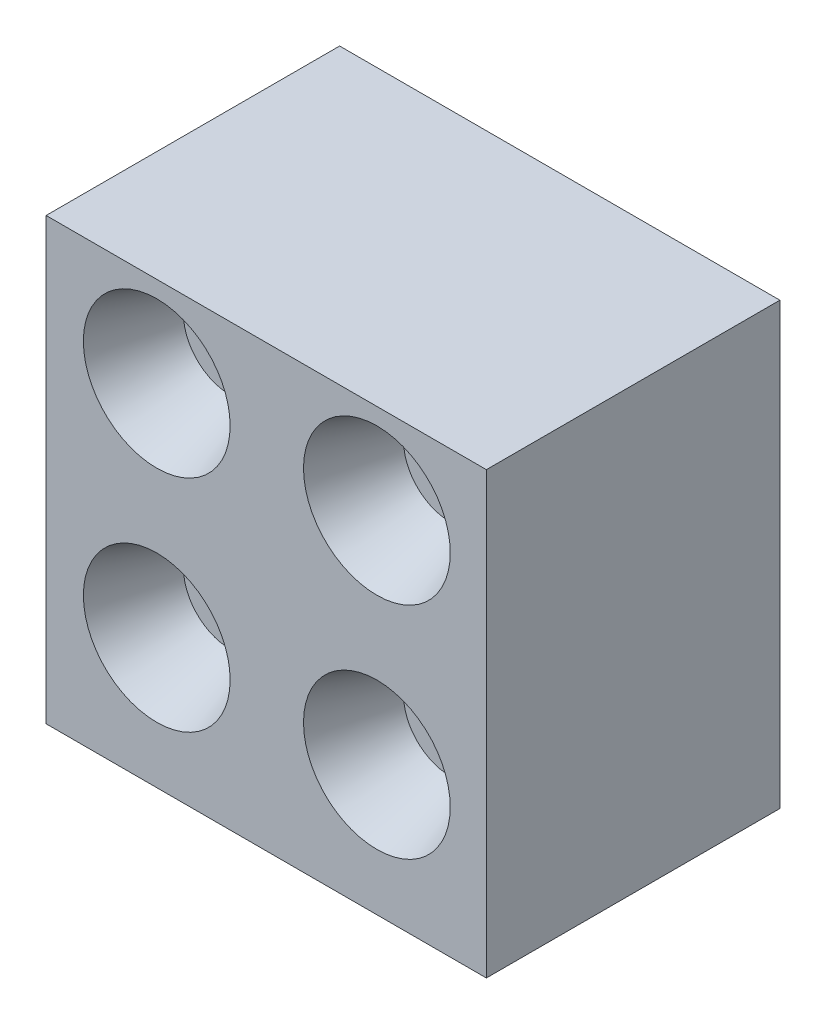
ISO-10303-21;
HEADER;
FILE_DESCRIPTION(('STEP AP214'),'2;1');
FILE_NAME('part.step','',(''),(''),'','','');
FILE_SCHEMA(('AUTOMOTIVE_DESIGN { 1 0 10303 214 1 1 1 1 }'));
ENDSEC;
DATA;
#1=APPLICATION_CONTEXT('core data for automotive mechanical design processes');
#2=APPLICATION_PROTOCOL_DEFINITION('international standard','automotive_design',2000,#1);
#3=PRODUCT_CONTEXT('',#1,'mechanical');
#4=PRODUCT('Part','Part','',(#3));
#5=PRODUCT_RELATED_PRODUCT_CATEGORY('part','',(#4));
#6=PRODUCT_DEFINITION_FORMATION('','',#4);
#7=PRODUCT_DEFINITION_CONTEXT('part definition',#1,'design');
#8=PRODUCT_DEFINITION('design','',#6,#7);
#9=PRODUCT_DEFINITION_SHAPE('','',#8);
#10=(LENGTH_UNIT() NAMED_UNIT(*) SI_UNIT(.MILLI.,.METRE.));
#11=(NAMED_UNIT(*) PLANE_ANGLE_UNIT() SI_UNIT($,.RADIAN.));
#12=(NAMED_UNIT(*) SI_UNIT($,.STERADIAN.) SOLID_ANGLE_UNIT());
#13=UNCERTAINTY_MEASURE_WITH_UNIT(LENGTH_MEASURE(1.E-05),#10,'distance_accuracy_value','');
#14=(GEOMETRIC_REPRESENTATION_CONTEXT(3) GLOBAL_UNCERTAINTY_ASSIGNED_CONTEXT((#13)) GLOBAL_UNIT_ASSIGNED_CONTEXT((#10,
#11,#12)) REPRESENTATION_CONTEXT('',''));
#15=CARTESIAN_POINT('',(0.,0.,0.));
#16=DIRECTION('',(0.,0.,1.));
#17=DIRECTION('',(1.,0.,0.));
#18=AXIS2_PLACEMENT_3D('',#15,#16,#17);
#19=CARTESIAN_POINT('',(0.,0.,2032.));
#20=DIRECTION('',(0.,0.,-1.));
#21=DIRECTION('',(-1.,0.,0.));
#22=AXIS2_PLACEMENT_3D('',#19,#20,#21);
#23=PLANE('',#22);
#24=CARTESIAN_POINT('',(765.92836786042,2423.7314825899,2032.));
#25=DIRECTION('',(0.,0.,-1.));
#26=DIRECTION('',(-1.,0.,0.));
#27=AXIS2_PLACEMENT_3D('',#24,#25,#26);
#28=CIRCLE('',#27,508.);
#29=CARTESIAN_POINT('',(257.92836786042,2423.7314825899,2032.));
#30=VERTEX_POINT('',#29);
#31=EDGE_CURVE('E188',#30,#30,#28,.T.);
#32=ORIENTED_EDGE('',*,*,#31,.T.);
#33=EDGE_LOOP('',(#32));
#34=FACE_BOUND('',#33,.T.);
#35=DIRECTION('',(0.,-1.,0.));
#36=VECTOR('',#35,1.);
#37=CARTESIAN_POINT('',(0.,0.,2032.));
#38=LINE('',#37,#36);
#39=CARTESIAN_POINT('',(0.,3048.,2032.));
#40=VERTEX_POINT('',#39);
#41=CARTESIAN_POINT('',(0.,0.,2032.));
#42=VERTEX_POINT('',#41);
#43=EDGE_CURVE('E89',#40,#42,#38,.T.);
#44=ORIENTED_EDGE('',*,*,#43,.T.);
#45=DIRECTION('',(1.,0.,0.));
#46=VECTOR('',#45,1.);
#47=CARTESIAN_POINT('',(0.,0.,2032.));
#48=LINE('',#47,#46);
#49=CARTESIAN_POINT('',(3048.,0.,2032.));
#50=VERTEX_POINT('',#49);
#51=EDGE_CURVE('E84',#42,#50,#48,.T.);
#52=ORIENTED_EDGE('',*,*,#51,.T.);
#53=DIRECTION('',(0.,1.,0.));
#54=VECTOR('',#53,1.);
#55=CARTESIAN_POINT('',(3048.,0.,2032.));
#56=LINE('',#55,#54);
#57=CARTESIAN_POINT('',(3048.,3048.,2032.));
#58=VERTEX_POINT('',#57);
#59=EDGE_CURVE('E87',#50,#58,#56,.T.);
#60=ORIENTED_EDGE('',*,*,#59,.T.);
#61=DIRECTION('',(-1.,0.,0.));
#62=VECTOR('',#61,1.);
#63=CARTESIAN_POINT('',(0.,3048.,2032.));
#64=LINE('',#63,#62);
#65=EDGE_CURVE('E53',#58,#40,#64,.T.);
#66=ORIENTED_EDGE('',*,*,#65,.T.);
#67=EDGE_LOOP('',(#44,#52,#60,#66));
#68=FACE_BOUND('',#67,.T.);
#69=CARTESIAN_POINT('',(2289.92836786042,2423.7314825899,2032.));
#70=DIRECTION('',(0.,0.,-1.));
#71=DIRECTION('',(-1.,0.,0.));
#72=AXIS2_PLACEMENT_3D('',#69,#70,#71);
#73=CIRCLE('',#72,508.);
#74=CARTESIAN_POINT('',(1781.92836786042,2423.7314825899,2032.));
#75=VERTEX_POINT('',#74);
#76=EDGE_CURVE('E195',#75,#75,#73,.T.);
#77=ORIENTED_EDGE('',*,*,#76,.T.);
#78=EDGE_LOOP('',(#77));
#79=FACE_BOUND('',#78,.T.);
#80=CARTESIAN_POINT('',(765.92836786042,899.7314825899,2032.));
#81=DIRECTION('',(0.,0.,-1.));
#82=DIRECTION('',(-1.,0.,0.));
#83=AXIS2_PLACEMENT_3D('',#80,#81,#82);
#84=CIRCLE('',#83,508.);
#85=CARTESIAN_POINT('',(257.92836786042,899.7314825899,2032.));
#86=VERTEX_POINT('',#85);
#87=EDGE_CURVE('E114',#86,#86,#84,.T.);
#88=ORIENTED_EDGE('',*,*,#87,.T.);
#89=EDGE_LOOP('',(#88));
#90=FACE_BOUND('',#89,.T.);
#91=CARTESIAN_POINT('',(2289.92836786042,899.7314825899,2032.));
#92=DIRECTION('',(0.,0.,-1.));
#93=DIRECTION('',(-1.,0.,0.));
#94=AXIS2_PLACEMENT_3D('',#91,#92,#93);
#95=CIRCLE('',#94,508.);
#96=CARTESIAN_POINT('',(1781.92836786042,899.7314825899,2032.));
#97=VERTEX_POINT('',#96);
#98=EDGE_CURVE('E45',#97,#97,#95,.T.);
#99=ORIENTED_EDGE('',*,*,#98,.T.);
#100=EDGE_LOOP('',(#99));
#101=FACE_BOUND('',#100,.T.);
#102=ADVANCED_FACE('F36',(#34,#68,#79,#90,#101),#23,.F.);
#103=CARTESIAN_POINT('',(0.,0.,2032.));
#104=DIRECTION('',(1.,0.,0.));
#105=DIRECTION('',(0.,0.,-1.));
#106=AXIS2_PLACEMENT_3D('',#103,#104,#105);
#107=PLANE('',#106);
#108=DIRECTION('',(0.,-1.,0.));
#109=VECTOR('',#108,1.);
#110=CARTESIAN_POINT('',(0.,0.,0.));
#111=LINE('',#110,#109);
#112=CARTESIAN_POINT('',(0.,3048.,0.));
#113=VERTEX_POINT('',#112);
#114=CARTESIAN_POINT('',(0.,0.,0.));
#115=VERTEX_POINT('',#114);
#116=EDGE_CURVE('E104',#113,#115,#111,.T.);
#117=ORIENTED_EDGE('',*,*,#116,.T.);
#118=DIRECTION('',(0.,0.,-1.));
#119=VECTOR('',#118,1.);
#120=CARTESIAN_POINT('',(0.,0.,2032.));
#121=LINE('',#120,#119);
#122=EDGE_CURVE('E95',#42,#115,#121,.T.);
#123=ORIENTED_EDGE('',*,*,#122,.F.);
#124=ORIENTED_EDGE('',*,*,#43,.F.);
#125=DIRECTION('',(0.,0.,-1.));
#126=VECTOR('',#125,1.);
#127=CARTESIAN_POINT('',(0.,3048.,2032.));
#128=LINE('',#127,#126);
#129=EDGE_CURVE('E100',#40,#113,#128,.T.);
#130=ORIENTED_EDGE('',*,*,#129,.T.);
#131=EDGE_LOOP('',(#117,#123,#124,#130));
#132=FACE_BOUND('',#131,.T.);
#133=ADVANCED_FACE('F133',(#132),#107,.F.);
#134=CARTESIAN_POINT('',(0.,0.,2032.));
#135=DIRECTION('',(0.,1.,0.));
#136=DIRECTION('',(0.,0.,1.));
#137=AXIS2_PLACEMENT_3D('',#134,#135,#136);
#138=PLANE('',#137);
#139=DIRECTION('',(1.,0.,0.));
#140=VECTOR('',#139,1.);
#141=CARTESIAN_POINT('',(0.,0.,0.));
#142=LINE('',#141,#140);
#143=CARTESIAN_POINT('',(3048.,0.,0.));
#144=VERTEX_POINT('',#143);
#145=EDGE_CURVE('E94',#115,#144,#142,.T.);
#146=ORIENTED_EDGE('',*,*,#145,.T.);
#147=DIRECTION('',(0.,0.,-1.));
#148=VECTOR('',#147,1.);
#149=CARTESIAN_POINT('',(3048.,0.,2032.));
#150=LINE('',#149,#148);
#151=EDGE_CURVE('E92',#50,#144,#150,.T.);
#152=ORIENTED_EDGE('',*,*,#151,.F.);
#153=ORIENTED_EDGE('',*,*,#51,.F.);
#154=ORIENTED_EDGE('',*,*,#122,.T.);
#155=EDGE_LOOP('',(#146,#152,#153,#154));
#156=FACE_BOUND('',#155,.T.);
#157=ADVANCED_FACE('F93',(#156),#138,.F.);
#158=CARTESIAN_POINT('',(3048.,0.,2032.));
#159=DIRECTION('',(-1.,0.,0.));
#160=DIRECTION('',(0.,0.,1.));
#161=AXIS2_PLACEMENT_3D('',#158,#159,#160);
#162=PLANE('',#161);
#163=DIRECTION('',(0.,1.,0.));
#164=VECTOR('',#163,1.);
#165=CARTESIAN_POINT('',(3048.,0.,0.));
#166=LINE('',#165,#164);
#167=CARTESIAN_POINT('',(3048.,3048.,0.));
#168=VERTEX_POINT('',#167);
#169=EDGE_CURVE('E70',#144,#168,#166,.T.);
#170=ORIENTED_EDGE('',*,*,#169,.T.);
#171=DIRECTION('',(0.,0.,-1.));
#172=VECTOR('',#171,1.);
#173=CARTESIAN_POINT('',(3048.,3048.,2032.));
#174=LINE('',#173,#172);
#175=EDGE_CURVE('E96',#58,#168,#174,.T.);
#176=ORIENTED_EDGE('',*,*,#175,.F.);
#177=ORIENTED_EDGE('',*,*,#59,.F.);
#178=ORIENTED_EDGE('',*,*,#151,.T.);
#179=EDGE_LOOP('',(#170,#176,#177,#178));
#180=FACE_BOUND('',#179,.T.);
#181=ADVANCED_FACE('F98',(#180),#162,.F.);
#182=CARTESIAN_POINT('',(0.,3048.,2032.));
#183=DIRECTION('',(0.,-1.,0.));
#184=DIRECTION('',(0.,0.,-1.));
#185=AXIS2_PLACEMENT_3D('',#182,#183,#184);
#186=PLANE('',#185);
#187=DIRECTION('',(-1.,0.,0.));
#188=VECTOR('',#187,1.);
#189=CARTESIAN_POINT('',(0.,3048.,0.));
#190=LINE('',#189,#188);
#191=EDGE_CURVE('E76',#168,#113,#190,.T.);
#192=ORIENTED_EDGE('',*,*,#191,.T.);
#193=ORIENTED_EDGE('',*,*,#129,.F.);
#194=ORIENTED_EDGE('',*,*,#65,.F.);
#195=ORIENTED_EDGE('',*,*,#175,.T.);
#196=EDGE_LOOP('',(#192,#193,#194,#195));
#197=FACE_BOUND('',#196,.T.);
#198=ADVANCED_FACE('F149',(#197),#186,.F.);
#199=CARTESIAN_POINT('',(0.,0.,0.));
#200=DIRECTION('',(0.,0.,-1.));
#201=DIRECTION('',(-1.,0.,0.));
#202=AXIS2_PLACEMENT_3D('',#199,#200,#201);
#203=PLANE('',#202);
#204=ORIENTED_EDGE('',*,*,#116,.F.);
#205=ORIENTED_EDGE('',*,*,#191,.F.);
#206=ORIENTED_EDGE('',*,*,#169,.F.);
#207=ORIENTED_EDGE('',*,*,#145,.F.);
#208=EDGE_LOOP('',(#204,#205,#206,#207));
#209=FACE_BOUND('',#208,.T.);
#210=ADVANCED_FACE('F146',(#209),#203,.T.);
#211=CARTESIAN_POINT('',(765.92836786042,2423.7314825899,2032.));
#212=DIRECTION('',(0.,0.,1.));
#213=DIRECTION('',(-1.,0.,0.));
#214=AXIS2_PLACEMENT_3D('',#211,#212,#213);
#215=CONICAL_SURFACE('',#214,508.,0.349065850398867);
#216=CARTESIAN_POINT('',(765.92836786042,2423.7314825899,1524.));
#217=DIRECTION('',(0.,0.,-1.));
#218=DIRECTION('',(-1.,0.,0.));
#219=AXIS2_PLACEMENT_3D('',#216,#217,#218);
#220=CIRCLE('',#219,323.103120992769);
#221=CARTESIAN_POINT('',(442.825246867651,2423.7314825899,1524.));
#222=VERTEX_POINT('',#221);
#223=EDGE_CURVE('E107',#222,#222,#220,.T.);
#224=ORIENTED_EDGE('',*,*,#223,.T.);
#225=EDGE_LOOP('',(#224));
#226=FACE_BOUND('',#225,.T.);
#227=ORIENTED_EDGE('',*,*,#31,.F.);
#228=EDGE_LOOP('',(#227));
#229=FACE_BOUND('',#228,.T.);
#230=ADVANCED_FACE('F144',(#226,#229),#215,.F.);
#231=CARTESIAN_POINT('',(765.92836786042,2423.7314825899,1524.));
#232=DIRECTION('',(0.,0.,-1.));
#233=DIRECTION('',(-1.,0.,0.));
#234=AXIS2_PLACEMENT_3D('',#231,#232,#233);
#235=PLANE('',#234);
#236=ORIENTED_EDGE('',*,*,#223,.F.);
#237=EDGE_LOOP('',(#236));
#238=FACE_BOUND('',#237,.T.);
#239=ADVANCED_FACE('F176',(#238),#235,.F.);
#240=CARTESIAN_POINT('',(2289.92836786042,2423.7314825899,2032.));
#241=DIRECTION('',(0.,0.,1.));
#242=DIRECTION('',(-1.,0.,0.));
#243=AXIS2_PLACEMENT_3D('',#240,#241,#242);
#244=CONICAL_SURFACE('',#243,508.,0.349065850398867);
#245=CARTESIAN_POINT('',(2289.92836786042,2423.7314825899,1524.));
#246=DIRECTION('',(0.,0.,-1.));
#247=DIRECTION('',(-1.,0.,0.));
#248=AXIS2_PLACEMENT_3D('',#245,#246,#247);
#249=CIRCLE('',#248,323.103120992769);
#250=CARTESIAN_POINT('',(1966.82524686765,2423.7314825899,1524.));
#251=VERTEX_POINT('',#250);
#252=EDGE_CURVE('E190',#251,#251,#249,.T.);
#253=ORIENTED_EDGE('',*,*,#252,.T.);
#254=EDGE_LOOP('',(#253));
#255=FACE_BOUND('',#254,.T.);
#256=ORIENTED_EDGE('',*,*,#76,.F.);
#257=EDGE_LOOP('',(#256));
#258=FACE_BOUND('',#257,.T.);
#259=ADVANCED_FACE('F166',(#255,#258),#244,.F.);
#260=CARTESIAN_POINT('',(2289.92836786042,2423.7314825899,1524.));
#261=DIRECTION('',(0.,0.,-1.));
#262=DIRECTION('',(-1.,0.,0.));
#263=AXIS2_PLACEMENT_3D('',#260,#261,#262);
#264=PLANE('',#263);
#265=ORIENTED_EDGE('',*,*,#252,.F.);
#266=EDGE_LOOP('',(#265));
#267=FACE_BOUND('',#266,.T.);
#268=ADVANCED_FACE('F161',(#267),#264,.F.);
#269=CARTESIAN_POINT('',(765.92836786042,899.7314825899,1524.));
#270=DIRECTION('',(0.,0.,-1.));
#271=DIRECTION('',(-1.,0.,0.));
#272=AXIS2_PLACEMENT_3D('',#269,#270,#271);
#273=PLANE('',#272);
#274=CARTESIAN_POINT('',(765.92836786042,899.7314825899,1524.));
#275=DIRECTION('',(0.,0.,-1.));
#276=DIRECTION('',(-1.,0.,0.));
#277=AXIS2_PLACEMENT_3D('',#274,#275,#276);
#278=CIRCLE('',#277,323.103120992769);
#279=CARTESIAN_POINT('',(442.825246867651,899.7314825899,1524.));
#280=VERTEX_POINT('',#279);
#281=EDGE_CURVE('E117',#280,#280,#278,.T.);
#282=ORIENTED_EDGE('',*,*,#281,.F.);
#283=EDGE_LOOP('',(#282));
#284=FACE_BOUND('',#283,.T.);
#285=ADVANCED_FACE('F158',(#284),#273,.F.);
#286=CARTESIAN_POINT('',(765.92836786042,899.7314825899,2032.));
#287=DIRECTION('',(0.,0.,1.));
#288=DIRECTION('',(-1.,0.,0.));
#289=AXIS2_PLACEMENT_3D('',#286,#287,#288);
#290=CONICAL_SURFACE('',#289,508.,0.349065850398867);
#291=ORIENTED_EDGE('',*,*,#281,.T.);
#292=EDGE_LOOP('',(#291));
#293=FACE_BOUND('',#292,.T.);
#294=ORIENTED_EDGE('',*,*,#87,.F.);
#295=EDGE_LOOP('',(#294));
#296=FACE_BOUND('',#295,.T.);
#297=ADVANCED_FACE('F129',(#293,#296),#290,.F.);
#298=CARTESIAN_POINT('',(2289.92836786042,899.7314825899,1524.));
#299=DIRECTION('',(0.,0.,-1.));
#300=DIRECTION('',(-1.,0.,0.));
#301=AXIS2_PLACEMENT_3D('',#298,#299,#300);
#302=PLANE('',#301);
#303=CARTESIAN_POINT('',(2289.92836786042,899.7314825899,1524.));
#304=DIRECTION('',(0.,0.,-1.));
#305=DIRECTION('',(-1.,0.,0.));
#306=AXIS2_PLACEMENT_3D('',#303,#304,#305);
#307=CIRCLE('',#306,323.103120992769);
#308=CARTESIAN_POINT('',(1966.82524686765,899.7314825899,1524.));
#309=VERTEX_POINT('',#308);
#310=EDGE_CURVE('E11',#309,#309,#307,.T.);
#311=ORIENTED_EDGE('',*,*,#310,.F.);
#312=EDGE_LOOP('',(#311));
#313=FACE_BOUND('',#312,.T.);
#314=ADVANCED_FACE('F38',(#313),#302,.F.);
#315=CARTESIAN_POINT('',(2289.92836786042,899.7314825899,2032.));
#316=DIRECTION('',(0.,0.,1.));
#317=DIRECTION('',(-1.,0.,0.));
#318=AXIS2_PLACEMENT_3D('',#315,#316,#317);
#319=CONICAL_SURFACE('',#318,508.,0.349065850398867);
#320=ORIENTED_EDGE('',*,*,#310,.T.);
#321=EDGE_LOOP('',(#320));
#322=FACE_BOUND('',#321,.T.);
#323=ORIENTED_EDGE('',*,*,#98,.F.);
#324=EDGE_LOOP('',(#323));
#325=FACE_BOUND('',#324,.T.);
#326=ADVANCED_FACE('F123',(#322,#325),#319,.F.);
#327=CLOSED_SHELL('',(#102,#133,#157,#181,#198,#210,#230,#239,#259,#268,#285,#297,#314,#326));
#328=MANIFOLD_SOLID_BREP('B2',#327);
#329=ADVANCED_BREP_SHAPE_REPRESENTATION('',(#18,#328),#14);
#330=SHAPE_DEFINITION_REPRESENTATION(#9,#329);
ENDSEC;
END-ISO-10303-21;
